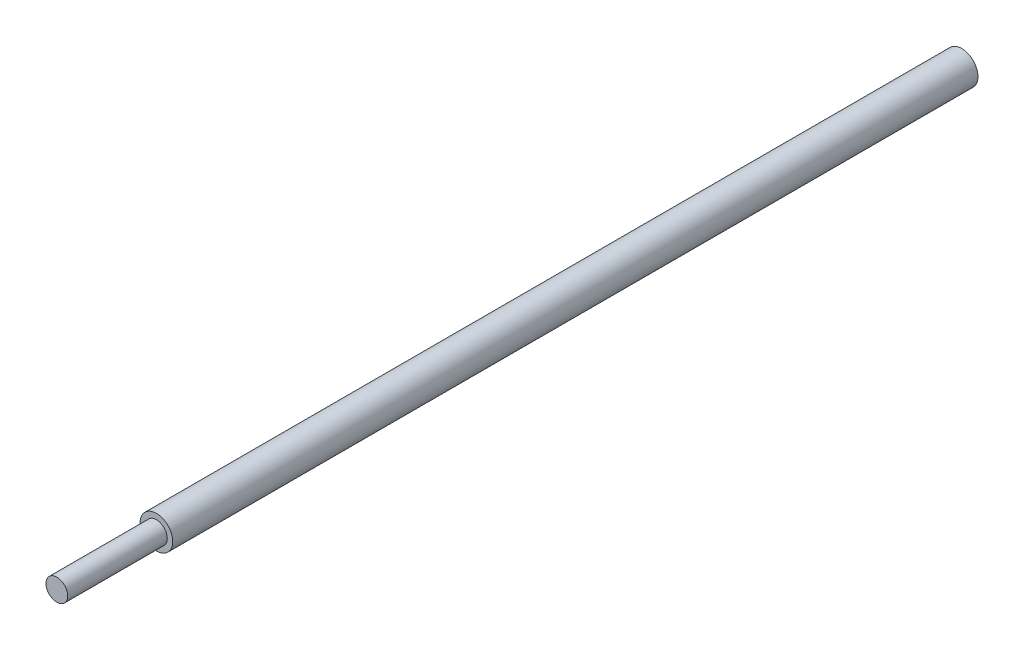
ISO-10303-21;
HEADER;
FILE_DESCRIPTION(('STEP AP214'),'2;1');
FILE_NAME('part.step','',(''),(''),'','','');
FILE_SCHEMA(('AUTOMOTIVE_DESIGN { 1 0 10303 214 1 1 1 1 }'));
ENDSEC;
DATA;
#1=APPLICATION_CONTEXT('core data for automotive mechanical design processes');
#2=APPLICATION_PROTOCOL_DEFINITION('international standard','automotive_design',2000,#1);
#3=PRODUCT_CONTEXT('',#1,'mechanical');
#4=PRODUCT('Part','Part','',(#3));
#5=PRODUCT_RELATED_PRODUCT_CATEGORY('part','',(#4));
#6=PRODUCT_DEFINITION_FORMATION('','',#4);
#7=PRODUCT_DEFINITION_CONTEXT('part definition',#1,'design');
#8=PRODUCT_DEFINITION('design','',#6,#7);
#9=PRODUCT_DEFINITION_SHAPE('','',#8);
#10=(LENGTH_UNIT() NAMED_UNIT(*) SI_UNIT(.MILLI.,.METRE.));
#11=(NAMED_UNIT(*) PLANE_ANGLE_UNIT() SI_UNIT($,.RADIAN.));
#12=(NAMED_UNIT(*) SI_UNIT($,.STERADIAN.) SOLID_ANGLE_UNIT());
#13=UNCERTAINTY_MEASURE_WITH_UNIT(LENGTH_MEASURE(1.E-05),#10,'distance_accuracy_value','');
#14=(GEOMETRIC_REPRESENTATION_CONTEXT(3) GLOBAL_UNCERTAINTY_ASSIGNED_CONTEXT((#13)) GLOBAL_UNIT_ASSIGNED_CONTEXT((#10,
#11,#12)) REPRESENTATION_CONTEXT('',''));
#15=CARTESIAN_POINT('',(0.,0.,0.));
#16=DIRECTION('',(0.,0.,1.));
#17=DIRECTION('',(1.,0.,0.));
#18=AXIS2_PLACEMENT_3D('',#15,#16,#17);
#19=CARTESIAN_POINT('',(0.,0.,83.25));
#20=DIRECTION('',(0.,0.,-1.));
#21=DIRECTION('',(-1.,0.,0.));
#22=AXIS2_PLACEMENT_3D('',#19,#20,#21);
#23=CYLINDRICAL_SURFACE('',#22,3.);
#24=CARTESIAN_POINT('',(0.,0.,-83.25));
#25=DIRECTION('',(0.,0.,1.));
#26=DIRECTION('',(1.,0.,0.));
#27=AXIS2_PLACEMENT_3D('',#24,#25,#26);
#28=CIRCLE('',#27,3.);
#29=CARTESIAN_POINT('',(3.,0.,-83.25));
#30=VERTEX_POINT('',#29);
#31=EDGE_CURVE('E10',#30,#30,#28,.T.);
#32=ORIENTED_EDGE('',*,*,#31,.T.);
#33=EDGE_LOOP('',(#32));
#34=FACE_BOUND('',#33,.T.);
#35=CARTESIAN_POINT('',(0.,0.,64.93));
#36=DIRECTION('',(0.,0.,1.));
#37=DIRECTION('',(1.,0.,0.));
#38=AXIS2_PLACEMENT_3D('',#35,#36,#37);
#39=CIRCLE('',#38,3.);
#40=CARTESIAN_POINT('',(3.,0.,64.93));
#41=VERTEX_POINT('',#40);
#42=EDGE_CURVE('E40',#41,#41,#39,.T.);
#43=ORIENTED_EDGE('',*,*,#42,.F.);
#44=EDGE_LOOP('',(#43));
#45=FACE_BOUND('',#44,.T.);
#46=ADVANCED_FACE('F34',(#34,#45),#23,.T.);
#47=CARTESIAN_POINT('',(0.,0.,-83.25));
#48=DIRECTION('',(0.,0.,1.));
#49=DIRECTION('',(1.,0.,0.));
#50=AXIS2_PLACEMENT_3D('',#47,#48,#49);
#51=PLANE('',#50);
#52=ORIENTED_EDGE('',*,*,#31,.F.);
#53=EDGE_LOOP('',(#52));
#54=FACE_BOUND('',#53,.T.);
#55=ADVANCED_FACE('F66',(#54),#51,.F.);
#56=CARTESIAN_POINT('',(0.,0.,64.93));
#57=DIRECTION('',(0.,0.,1.));
#58=DIRECTION('',(1.,0.,0.));
#59=AXIS2_PLACEMENT_3D('',#56,#57,#58);
#60=PLANE('',#59);
#61=CARTESIAN_POINT('',(0.,0.,64.93));
#62=DIRECTION('',(0.,0.,1.));
#63=DIRECTION('',(1.,0.,0.));
#64=AXIS2_PLACEMENT_3D('',#61,#62,#63);
#65=CIRCLE('',#64,2.);
#66=CARTESIAN_POINT('',(2.,0.,64.93));
#67=VERTEX_POINT('',#66);
#68=EDGE_CURVE('E44',#67,#67,#65,.T.);
#69=ORIENTED_EDGE('',*,*,#68,.F.);
#70=EDGE_LOOP('',(#69));
#71=FACE_BOUND('',#70,.T.);
#72=ORIENTED_EDGE('',*,*,#42,.T.);
#73=EDGE_LOOP('',(#72));
#74=FACE_BOUND('',#73,.T.);
#75=ADVANCED_FACE('F58',(#71,#74),#60,.T.);
#76=CARTESIAN_POINT('',(0.,0.,64.93));
#77=DIRECTION('',(0.,0.,1.));
#78=DIRECTION('',(1.,0.,0.));
#79=AXIS2_PLACEMENT_3D('',#76,#77,#78);
#80=CYLINDRICAL_SURFACE('',#79,2.);
#81=ORIENTED_EDGE('',*,*,#68,.T.);
#82=EDGE_LOOP('',(#81));
#83=FACE_BOUND('',#82,.T.);
#84=CARTESIAN_POINT('',(0.,0.,83.25));
#85=DIRECTION('',(0.,0.,1.));
#86=DIRECTION('',(1.,0.,0.));
#87=AXIS2_PLACEMENT_3D('',#84,#85,#86);
#88=CIRCLE('',#87,2.);
#89=CARTESIAN_POINT('',(2.,0.,83.25));
#90=VERTEX_POINT('',#89);
#91=EDGE_CURVE('E48',#90,#90,#88,.T.);
#92=ORIENTED_EDGE('',*,*,#91,.F.);
#93=EDGE_LOOP('',(#92));
#94=FACE_BOUND('',#93,.T.);
#95=ADVANCED_FACE('F56',(#83,#94),#80,.T.);
#96=CARTESIAN_POINT('',(0.,0.,83.25));
#97=DIRECTION('',(0.,0.,1.));
#98=DIRECTION('',(1.,0.,0.));
#99=AXIS2_PLACEMENT_3D('',#96,#97,#98);
#100=PLANE('',#99);
#101=ORIENTED_EDGE('',*,*,#91,.T.);
#102=EDGE_LOOP('',(#101));
#103=FACE_BOUND('',#102,.T.);
#104=ADVANCED_FACE('F54',(#103),#100,.T.);
#105=CLOSED_SHELL('',(#46,#55,#75,#95,#104));
#106=MANIFOLD_SOLID_BREP('B2',#105);
#107=ADVANCED_BREP_SHAPE_REPRESENTATION('',(#18,#106),#14);
#108=SHAPE_DEFINITION_REPRESENTATION(#9,#107);
ENDSEC;
END-ISO-10303-21;
